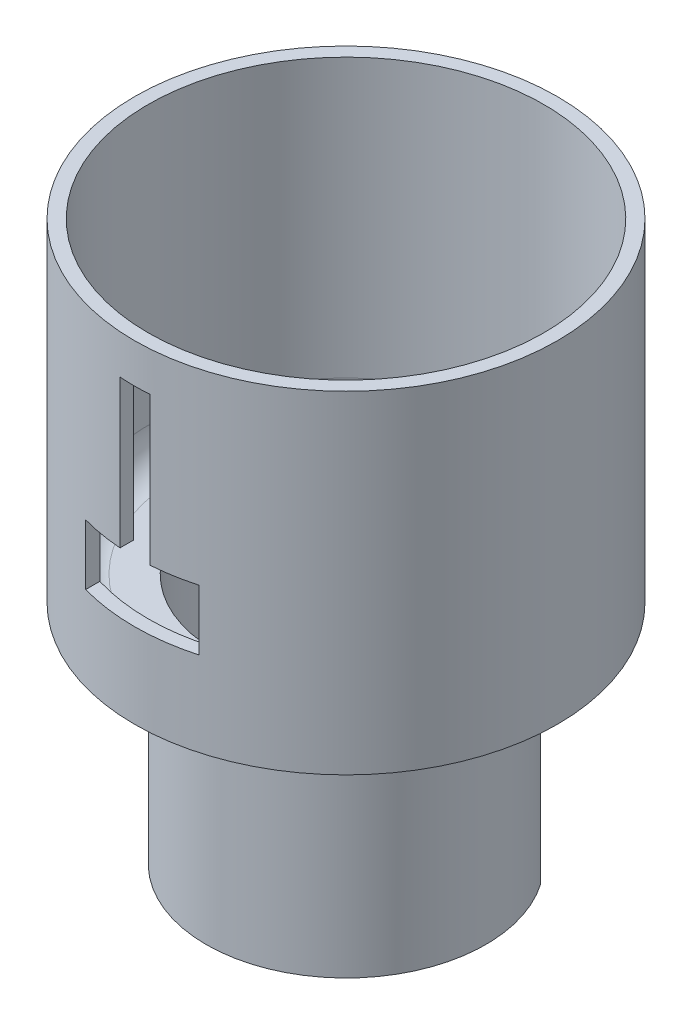
ISO-10303-21;
HEADER;
FILE_DESCRIPTION(('STEP AP214'),'2;1');
FILE_NAME('part.step','',(''),(''),'','','');
FILE_SCHEMA(('AUTOMOTIVE_DESIGN { 1 0 10303 214 1 1 1 1 }'));
ENDSEC;
DATA;
#1=APPLICATION_CONTEXT('core data for automotive mechanical design processes');
#2=APPLICATION_PROTOCOL_DEFINITION('international standard','automotive_design',2000,#1);
#3=PRODUCT_CONTEXT('',#1,'mechanical');
#4=PRODUCT('Part','Part','',(#3));
#5=PRODUCT_RELATED_PRODUCT_CATEGORY('part','',(#4));
#6=PRODUCT_DEFINITION_FORMATION('','',#4);
#7=PRODUCT_DEFINITION_CONTEXT('part definition',#1,'design');
#8=PRODUCT_DEFINITION('design','',#6,#7);
#9=PRODUCT_DEFINITION_SHAPE('','',#8);
#10=(LENGTH_UNIT() NAMED_UNIT(*) SI_UNIT(.MILLI.,.METRE.));
#11=(NAMED_UNIT(*) PLANE_ANGLE_UNIT() SI_UNIT($,.RADIAN.));
#12=(NAMED_UNIT(*) SI_UNIT($,.STERADIAN.) SOLID_ANGLE_UNIT());
#13=UNCERTAINTY_MEASURE_WITH_UNIT(LENGTH_MEASURE(1.E-05),#10,'distance_accuracy_value','');
#14=(GEOMETRIC_REPRESENTATION_CONTEXT(3) GLOBAL_UNCERTAINTY_ASSIGNED_CONTEXT((#13)) GLOBAL_UNIT_ASSIGNED_CONTEXT((#10,
#11,#12)) REPRESENTATION_CONTEXT('',''));
#15=CARTESIAN_POINT('',(0.,0.,0.));
#16=DIRECTION('',(0.,0.,1.));
#17=DIRECTION('',(1.,0.,0.));
#18=AXIS2_PLACEMENT_3D('',#15,#16,#17);
#19=CARTESIAN_POINT('',(0.,27.94,0.));
#20=DIRECTION('',(0.,-1.,0.));
#21=DIRECTION('',(0.,0.,-1.));
#22=AXIS2_PLACEMENT_3D('',#19,#20,#21);
#23=CYLINDRICAL_SURFACE('',#22,17.78);
#24=CARTESIAN_POINT('',(0.,27.94,0.));
#25=DIRECTION('',(0.,1.,0.));
#26=DIRECTION('',(0.,0.,1.));
#27=AXIS2_PLACEMENT_3D('',#24,#25,#26);
#28=CIRCLE('',#27,17.78);
#29=CARTESIAN_POINT('',(0.,27.94,17.78));
#30=VERTEX_POINT('',#29);
#31=EDGE_CURVE('E294',#30,#30,#28,.T.);
#32=ORIENTED_EDGE('',*,*,#31,.F.);
#33=EDGE_LOOP('',(#32));
#34=FACE_BOUND('',#33,.T.);
#35=CARTESIAN_POINT('',(0.,0.,0.));
#36=DIRECTION('',(0.,1.,0.));
#37=DIRECTION('',(0.,0.,1.));
#38=AXIS2_PLACEMENT_3D('',#35,#36,#37);
#39=CIRCLE('',#38,17.78);
#40=CARTESIAN_POINT('',(0.,0.,17.78));
#41=VERTEX_POINT('',#40);
#42=EDGE_CURVE('E292',#41,#41,#39,.T.);
#43=ORIENTED_EDGE('',*,*,#42,.T.);
#44=EDGE_LOOP('',(#43));
#45=FACE_BOUND('',#44,.T.);
#46=CARTESIAN_POINT('',(0.,7.112,0.));
#47=DIRECTION('',(0.,1.,0.));
#48=DIRECTION('',(-1.,0.,0.));
#49=AXIS2_PLACEMENT_3D('',#46,#47,#48);
#50=CIRCLE('',#49,17.78);
#51=CARTESIAN_POINT('',(-4.7625,7.112,17.1302946194746));
#52=VERTEX_POINT('',#51);
#53=CARTESIAN_POINT('',(4.7625,7.11200000000001,17.1302946194746));
#54=VERTEX_POINT('',#53);
#55=EDGE_CURVE('E353',#52,#54,#50,.T.);
#56=ORIENTED_EDGE('',*,*,#55,.F.);
#57=DIRECTION('',(0.,-1.,0.));
#58=VECTOR('',#57,1.);
#59=CARTESIAN_POINT('',(-4.76250000000001,27.94,17.1302946194746));
#60=LINE('',#59,#58);
#61=CARTESIAN_POINT('',(-4.7625,12.192,17.1302946194746));
#62=VERTEX_POINT('',#61);
#63=EDGE_CURVE('E356',#62,#52,#60,.T.);
#64=ORIENTED_EDGE('',*,*,#63,.F.);
#65=CARTESIAN_POINT('',(0.,12.192,0.));
#66=DIRECTION('',(0.,-1.,0.));
#67=DIRECTION('',(0.,0.,-1.));
#68=AXIS2_PLACEMENT_3D('',#65,#66,#67);
#69=CIRCLE('',#68,17.78);
#70=CARTESIAN_POINT('',(-1.27,12.192,17.7345848555866));
#71=VERTEX_POINT('',#70);
#72=EDGE_CURVE('E199',#71,#62,#69,.T.);
#73=ORIENTED_EDGE('',*,*,#72,.F.);
#74=DIRECTION('',(0.,-1.,0.));
#75=VECTOR('',#74,1.);
#76=CARTESIAN_POINT('',(-1.27000000000001,27.94,17.7345848555866));
#77=LINE('',#76,#75);
#78=CARTESIAN_POINT('',(-1.27000000000001,24.638,17.7345848555866));
#79=VERTEX_POINT('',#78);
#80=EDGE_CURVE('E193',#79,#71,#77,.T.);
#81=ORIENTED_EDGE('',*,*,#80,.F.);
#82=CARTESIAN_POINT('',(0.,24.638,0.));
#83=DIRECTION('',(0.,-1.,0.));
#84=DIRECTION('',(0.,0.,-1.));
#85=AXIS2_PLACEMENT_3D('',#82,#83,#84);
#86=CIRCLE('',#85,17.78);
#87=CARTESIAN_POINT('',(1.26999999999999,24.638,17.7345848555866));
#88=VERTEX_POINT('',#87);
#89=EDGE_CURVE('E183',#88,#79,#86,.T.);
#90=ORIENTED_EDGE('',*,*,#89,.F.);
#91=DIRECTION('',(0.,-1.,0.));
#92=VECTOR('',#91,1.);
#93=CARTESIAN_POINT('',(1.26999999999999,27.94,17.7345848555866));
#94=LINE('',#93,#92);
#95=CARTESIAN_POINT('',(1.27,12.192,17.7345848555866));
#96=VERTEX_POINT('',#95);
#97=EDGE_CURVE('E173',#96,#88,#94,.F.);
#98=ORIENTED_EDGE('',*,*,#97,.F.);
#99=CARTESIAN_POINT('',(0.,12.192,0.));
#100=DIRECTION('',(0.,-1.,0.));
#101=DIRECTION('',(1.,0.,0.));
#102=AXIS2_PLACEMENT_3D('',#99,#100,#101);
#103=CIRCLE('',#102,17.78);
#104=CARTESIAN_POINT('',(4.7625,12.192,17.1302946194746));
#105=VERTEX_POINT('',#104);
#106=EDGE_CURVE('E179',#105,#96,#103,.T.);
#107=ORIENTED_EDGE('',*,*,#106,.F.);
#108=DIRECTION('',(0.,-1.,0.));
#109=VECTOR('',#108,1.);
#110=CARTESIAN_POINT('',(4.7625,27.94,17.1302946194746));
#111=LINE('',#110,#109);
#112=EDGE_CURVE('E355',#54,#105,#111,.F.);
#113=ORIENTED_EDGE('',*,*,#112,.F.);
#114=EDGE_LOOP('',(#56,#64,#73,#81,#90,#98,#107,#113));
#115=FACE_BOUND('',#114,.T.);
#116=ADVANCED_FACE('F42',(#34,#45,#115),#23,.T.);
#117=CARTESIAN_POINT('',(0.,2.032,0.));
#118=DIRECTION('',(0.,1.,0.));
#119=DIRECTION('',(0.,0.,1.));
#120=AXIS2_PLACEMENT_3D('',#117,#118,#119);
#121=CYLINDRICAL_SURFACE('',#120,16.637);
#122=CARTESIAN_POINT('',(0.,27.94,0.));
#123=DIRECTION('',(0.,1.,0.));
#124=DIRECTION('',(0.,0.,1.));
#125=AXIS2_PLACEMENT_3D('',#122,#123,#124);
#126=CIRCLE('',#125,16.637);
#127=CARTESIAN_POINT('',(0.,27.94,16.637));
#128=VERTEX_POINT('',#127);
#129=EDGE_CURVE('E285',#128,#128,#126,.T.);
#130=ORIENTED_EDGE('',*,*,#129,.T.);
#131=EDGE_LOOP('',(#130));
#132=FACE_BOUND('',#131,.T.);
#133=CARTESIAN_POINT('',(0.,4.572,0.));
#134=DIRECTION('',(0.,1.,0.));
#135=DIRECTION('',(0.,0.,1.));
#136=AXIS2_PLACEMENT_3D('',#133,#134,#135);
#137=CIRCLE('',#136,16.637);
#138=CARTESIAN_POINT('',(0.,4.572,16.637));
#139=VERTEX_POINT('',#138);
#140=EDGE_CURVE('E308',#139,#139,#137,.F.);
#141=ORIENTED_EDGE('',*,*,#140,.T.);
#142=EDGE_LOOP('',(#141));
#143=FACE_BOUND('',#142,.T.);
#144=CARTESIAN_POINT('',(0.,24.638,0.));
#145=DIRECTION('',(0.,-1.,0.));
#146=DIRECTION('',(0.,0.,-1.));
#147=AXIS2_PLACEMENT_3D('',#144,#145,#146);
#148=CIRCLE('',#147,16.637);
#149=CARTESIAN_POINT('',(-1.27000000000001,24.638,16.588455895592));
#150=VERTEX_POINT('',#149);
#151=CARTESIAN_POINT('',(1.27000000000001,24.638,16.588455895592));
#152=VERTEX_POINT('',#151);
#153=EDGE_CURVE('E11',#150,#152,#148,.F.);
#154=ORIENTED_EDGE('',*,*,#153,.F.);
#155=DIRECTION('',(0.,1.,0.));
#156=VECTOR('',#155,1.);
#157=CARTESIAN_POINT('',(-1.27,2.032,16.588455895592));
#158=LINE('',#157,#156);
#159=CARTESIAN_POINT('',(-1.27,12.192,16.588455895592));
#160=VERTEX_POINT('',#159);
#161=EDGE_CURVE('E55',#160,#150,#158,.T.);
#162=ORIENTED_EDGE('',*,*,#161,.F.);
#163=CARTESIAN_POINT('',(0.,12.192,0.));
#164=DIRECTION('',(0.,-1.,0.));
#165=DIRECTION('',(0.,0.,-1.));
#166=AXIS2_PLACEMENT_3D('',#163,#164,#165);
#167=CIRCLE('',#166,16.637);
#168=CARTESIAN_POINT('',(-4.7625,12.192,15.9407767298209));
#169=VERTEX_POINT('',#168);
#170=EDGE_CURVE('E317',#169,#160,#167,.F.);
#171=ORIENTED_EDGE('',*,*,#170,.F.);
#172=DIRECTION('',(0.,1.,0.));
#173=VECTOR('',#172,1.);
#174=CARTESIAN_POINT('',(-4.7625,2.032,15.9407767298209));
#175=LINE('',#174,#173);
#176=CARTESIAN_POINT('',(-4.7625,7.112,15.9407767298209));
#177=VERTEX_POINT('',#176);
#178=EDGE_CURVE('E320',#177,#169,#175,.T.);
#179=ORIENTED_EDGE('',*,*,#178,.F.);
#180=CARTESIAN_POINT('',(0.,7.112,0.));
#181=DIRECTION('',(0.,1.,0.));
#182=DIRECTION('',(-1.,0.,0.));
#183=AXIS2_PLACEMENT_3D('',#180,#181,#182);
#184=CIRCLE('',#183,16.637);
#185=CARTESIAN_POINT('',(4.7625,7.11200000000001,15.9407767298209));
#186=VERTEX_POINT('',#185);
#187=EDGE_CURVE('E312',#186,#177,#184,.F.);
#188=ORIENTED_EDGE('',*,*,#187,.F.);
#189=DIRECTION('',(0.,1.,0.));
#190=VECTOR('',#189,1.);
#191=CARTESIAN_POINT('',(4.7625,2.032,15.9407767298209));
#192=LINE('',#191,#190);
#193=CARTESIAN_POINT('',(4.7625,12.192,15.9407767298209));
#194=VERTEX_POINT('',#193);
#195=EDGE_CURVE('E311',#194,#186,#192,.F.);
#196=ORIENTED_EDGE('',*,*,#195,.F.);
#197=CARTESIAN_POINT('',(0.,12.192,0.));
#198=DIRECTION('',(0.,-1.,0.));
#199=DIRECTION('',(1.,0.,0.));
#200=AXIS2_PLACEMENT_3D('',#197,#198,#199);
#201=CIRCLE('',#200,16.637);
#202=CARTESIAN_POINT('',(1.27,12.192,16.588455895592));
#203=VERTEX_POINT('',#202);
#204=EDGE_CURVE('E313',#203,#194,#201,.F.);
#205=ORIENTED_EDGE('',*,*,#204,.F.);
#206=DIRECTION('',(0.,1.,0.));
#207=VECTOR('',#206,1.);
#208=CARTESIAN_POINT('',(1.27000000000001,2.032,16.588455895592));
#209=LINE('',#208,#207);
#210=EDGE_CURVE('E310',#152,#203,#209,.F.);
#211=ORIENTED_EDGE('',*,*,#210,.F.);
#212=EDGE_LOOP('',(#154,#162,#171,#179,#188,#196,#205,#211));
#213=FACE_BOUND('',#212,.T.);
#214=ADVANCED_FACE('F328',(#132,#143,#213),#121,.F.);
#215=CARTESIAN_POINT('',(0.,-4.826,0.));
#216=DIRECTION('',(0.,1.,0.));
#217=DIRECTION('',(0.,0.,1.));
#218=AXIS2_PLACEMENT_3D('',#215,#216,#217);
#219=PLANE('',#218);
#220=CARTESIAN_POINT('',(0.,-4.826,0.));
#221=DIRECTION('',(0.,1.,0.));
#222=DIRECTION('',(0.,0.,1.));
#223=AXIS2_PLACEMENT_3D('',#220,#221,#222);
#224=CIRCLE('',#223,11.049);
#225=CARTESIAN_POINT('',(9.61949341909438,-4.826,-5.4356));
#226=VERTEX_POINT('',#225);
#227=CARTESIAN_POINT('',(-9.61949341909438,-4.826,-5.4356));
#228=VERTEX_POINT('',#227);
#229=EDGE_CURVE('E276',#226,#228,#224,.T.);
#230=ORIENTED_EDGE('',*,*,#229,.T.);
#231=DIRECTION('',(1.,0.,0.));
#232=VECTOR('',#231,1.);
#233=CARTESIAN_POINT('',(0.,-4.826,-5.4356));
#234=LINE('',#233,#232);
#235=EDGE_CURVE('E195',#228,#226,#234,.T.);
#236=ORIENTED_EDGE('',*,*,#235,.T.);
#237=EDGE_LOOP('',(#230,#236));
#238=FACE_BOUND('',#237,.T.);
#239=ADVANCED_FACE('F387',(#238),#219,.T.);
#240=CARTESIAN_POINT('',(-17.78,-19.05,-6.7056));
#241=DIRECTION('',(0.,0.,1.));
#242=DIRECTION('',(1.,0.,0.));
#243=AXIS2_PLACEMENT_3D('',#240,#241,#242);
#244=PLANE('',#243);
#245=DIRECTION('',(0.,-1.,0.));
#246=VECTOR('',#245,1.);
#247=CARTESIAN_POINT('',(0.9525,-19.05,-6.7056));
#248=LINE('',#247,#246);
#249=CARTESIAN_POINT('',(0.9525,-16.3922004312487,-6.7056));
#250=VERTEX_POINT('',#249);
#251=CARTESIAN_POINT('',(0.9525,-19.05,-6.7056));
#252=VERTEX_POINT('',#251);
#253=EDGE_CURVE('E225',#250,#252,#248,.T.);
#254=ORIENTED_EDGE('',*,*,#253,.F.);
#255=DIRECTION('',(1.,0.,0.));
#256=VECTOR('',#255,1.);
#257=CARTESIAN_POINT('',(-0.9525,-16.3922004312487,-6.7056));
#258=LINE('',#257,#256);
#259=CARTESIAN_POINT('',(-0.952499999999998,-16.3922004312487,-6.7056));
#260=VERTEX_POINT('',#259);
#261=EDGE_CURVE('E259',#260,#250,#258,.T.);
#262=ORIENTED_EDGE('',*,*,#261,.F.);
#263=DIRECTION('',(0.,-1.,0.));
#264=VECTOR('',#263,1.);
#265=CARTESIAN_POINT('',(-0.9525,-19.05,-6.7056));
#266=LINE('',#265,#264);
#267=CARTESIAN_POINT('',(-0.9525,-19.05,-6.7056));
#268=VERTEX_POINT('',#267);
#269=EDGE_CURVE('E239',#260,#268,#266,.T.);
#270=ORIENTED_EDGE('',*,*,#269,.T.);
#271=DIRECTION('',(1.,0.,0.));
#272=VECTOR('',#271,1.);
#273=CARTESIAN_POINT('',(-17.78,-19.05,-6.7056));
#274=LINE('',#273,#272);
#275=CARTESIAN_POINT('',(-9.66111963904805,-19.05,-6.7056));
#276=VERTEX_POINT('',#275);
#277=EDGE_CURVE('E264',#276,#268,#274,.T.);
#278=ORIENTED_EDGE('',*,*,#277,.F.);
#279=DIRECTION('',(0.,1.,0.));
#280=VECTOR('',#279,1.);
#281=CARTESIAN_POINT('',(-9.66111963904805,-19.05,-6.7056));
#282=LINE('',#281,#280);
#283=CARTESIAN_POINT('',(-9.66111963904805,-6.35,-6.7056));
#284=VERTEX_POINT('',#283);
#285=EDGE_CURVE('E275',#276,#284,#282,.T.);
#286=ORIENTED_EDGE('',*,*,#285,.T.);
#287=DIRECTION('',(1.,0.,0.));
#288=VECTOR('',#287,1.);
#289=CARTESIAN_POINT('',(-17.78,-6.35,-6.7056));
#290=LINE('',#289,#288);
#291=CARTESIAN_POINT('',(9.66111963904805,-6.35,-6.7056));
#292=VERTEX_POINT('',#291);
#293=EDGE_CURVE('E252',#284,#292,#290,.T.);
#294=ORIENTED_EDGE('',*,*,#293,.T.);
#295=DIRECTION('',(0.,1.,0.));
#296=VECTOR('',#295,1.);
#297=CARTESIAN_POINT('',(9.66111963904805,-19.05,-6.7056));
#298=LINE('',#297,#296);
#299=CARTESIAN_POINT('',(9.66111963904805,-19.05,-6.7056));
#300=VERTEX_POINT('',#299);
#301=EDGE_CURVE('E274',#292,#300,#298,.F.);
#302=ORIENTED_EDGE('',*,*,#301,.T.);
#303=EDGE_CURVE('E267',#252,#300,#274,.T.);
#304=ORIENTED_EDGE('',*,*,#303,.F.);
#305=EDGE_LOOP('',(#254,#262,#270,#278,#286,#294,#302,#304));
#306=FACE_BOUND('',#305,.T.);
#307=ADVANCED_FACE('F419',(#306),#244,.F.);
#308=CARTESIAN_POINT('',(-17.78,-6.35,-11.7602));
#309=DIRECTION('',(0.,1.,0.));
#310=DIRECTION('',(0.,0.,1.));
#311=AXIS2_PLACEMENT_3D('',#308,#309,#310);
#312=PLANE('',#311);
#313=DIRECTION('',(0.,0.,1.));
#314=VECTOR('',#313,1.);
#315=CARTESIAN_POINT('',(0.9525,-6.35,-9.7282));
#316=LINE('',#315,#314);
#317=CARTESIAN_POINT('',(0.9525,-6.35,-11.7215633679983));
#318=VERTEX_POINT('',#317);
#319=CARTESIAN_POINT('',(0.952499999999998,-6.35,-9.7282));
#320=VERTEX_POINT('',#319);
#321=EDGE_CURVE('E216',#318,#320,#316,.T.);
#322=ORIENTED_EDGE('',*,*,#321,.F.);
#323=CARTESIAN_POINT('',(0.,-6.35,0.));
#324=DIRECTION('',(0.,1.,0.));
#325=DIRECTION('',(0.,0.,1.));
#326=AXIS2_PLACEMENT_3D('',#323,#324,#325);
#327=CIRCLE('',#326,11.7602);
#328=EDGE_CURVE('E268',#318,#292,#327,.F.);
#329=ORIENTED_EDGE('',*,*,#328,.T.);
#330=ORIENTED_EDGE('',*,*,#293,.F.);
#331=CARTESIAN_POINT('',(-0.9525,-6.35,-11.7215633679983));
#332=VERTEX_POINT('',#331);
#333=EDGE_CURVE('E298',#284,#332,#327,.F.);
#334=ORIENTED_EDGE('',*,*,#333,.T.);
#335=DIRECTION('',(0.,0.,1.));
#336=VECTOR('',#335,1.);
#337=CARTESIAN_POINT('',(-0.9525,-6.35,-9.7282));
#338=LINE('',#337,#336);
#339=CARTESIAN_POINT('',(-0.9525,-6.35,-9.7282));
#340=VERTEX_POINT('',#339);
#341=EDGE_CURVE('E234',#332,#340,#338,.T.);
#342=ORIENTED_EDGE('',*,*,#341,.T.);
#343=DIRECTION('',(1.,0.,0.));
#344=VECTOR('',#343,1.);
#345=CARTESIAN_POINT('',(-0.9525,-6.35,-9.7282));
#346=LINE('',#345,#344);
#347=EDGE_CURVE('E249',#340,#320,#346,.T.);
#348=ORIENTED_EDGE('',*,*,#347,.T.);
#349=EDGE_LOOP('',(#322,#329,#330,#334,#342,#348));
#350=FACE_BOUND('',#349,.T.);
#351=ADVANCED_FACE('F397',(#350),#312,.F.);
#352=CARTESIAN_POINT('',(0.,27.94,0.));
#353=DIRECTION('',(0.,1.,0.));
#354=DIRECTION('',(0.,0.,1.));
#355=AXIS2_PLACEMENT_3D('',#352,#353,#354);
#356=PLANE('',#355);
#357=ORIENTED_EDGE('',*,*,#129,.F.);
#358=EDGE_LOOP('',(#357));
#359=FACE_BOUND('',#358,.T.);
#360=ORIENTED_EDGE('',*,*,#31,.T.);
#361=EDGE_LOOP('',(#360));
#362=FACE_BOUND('',#361,.T.);
#363=ADVANCED_FACE('F398',(#359,#362),#356,.T.);
#364=CARTESIAN_POINT('',(0.,0.,0.));
#365=DIRECTION('',(0.,1.,0.));
#366=DIRECTION('',(0.,0.,1.));
#367=AXIS2_PLACEMENT_3D('',#364,#365,#366);
#368=PLANE('',#367);
#369=CARTESIAN_POINT('',(0.,0.,0.));
#370=DIRECTION('',(0.,1.,0.));
#371=DIRECTION('',(0.,0.,1.));
#372=AXIS2_PLACEMENT_3D('',#369,#370,#371);
#373=CIRCLE('',#372,11.7602);
#374=CARTESIAN_POINT('',(0.,0.,11.7602));
#375=VERTEX_POINT('',#374);
#376=EDGE_CURVE('E290',#375,#375,#373,.T.);
#377=ORIENTED_EDGE('',*,*,#376,.T.);
#378=EDGE_LOOP('',(#377));
#379=FACE_BOUND('',#378,.T.);
#380=ORIENTED_EDGE('',*,*,#42,.F.);
#381=EDGE_LOOP('',(#380));
#382=FACE_BOUND('',#381,.T.);
#383=ADVANCED_FACE('F395',(#379,#382),#368,.F.);
#384=CARTESIAN_POINT('',(0.,-19.05,0.));
#385=DIRECTION('',(0.,1.,0.));
#386=DIRECTION('',(0.,0.,1.));
#387=AXIS2_PLACEMENT_3D('',#384,#385,#386);
#388=CYLINDRICAL_SURFACE('',#387,11.7602);
#389=ORIENTED_EDGE('',*,*,#301,.F.);
#390=ORIENTED_EDGE('',*,*,#328,.F.);
#391=CARTESIAN_POINT('',(0.,-6.35,-11.7602));
#392=VERTEX_POINT('',#391);
#393=EDGE_CURVE('E690',#392,#318,#327,.F.);
#394=ORIENTED_EDGE('',*,*,#393,.F.);
#395=EDGE_CURVE('E302',#332,#392,#327,.F.);
#396=ORIENTED_EDGE('',*,*,#395,.F.);
#397=ORIENTED_EDGE('',*,*,#333,.F.);
#398=ORIENTED_EDGE('',*,*,#285,.F.);
#399=CARTESIAN_POINT('',(0.,-19.05,0.));
#400=DIRECTION('',(0.,1.,0.));
#401=DIRECTION('',(0.,0.,1.));
#402=AXIS2_PLACEMENT_3D('',#399,#400,#401);
#403=CIRCLE('',#402,11.7602);
#404=EDGE_CURVE('E286',#276,#300,#403,.T.);
#405=ORIENTED_EDGE('',*,*,#404,.T.);
#406=EDGE_LOOP('',(#389,#390,#394,#396,#397,#398,#405));
#407=FACE_BOUND('',#406,.T.);
#408=ORIENTED_EDGE('',*,*,#376,.F.);
#409=EDGE_LOOP('',(#408));
#410=FACE_BOUND('',#409,.T.);
#411=ADVANCED_FACE('F394',(#407,#410),#388,.T.);
#412=CARTESIAN_POINT('',(0.,-19.05,0.));
#413=DIRECTION('',(0.,1.,0.));
#414=DIRECTION('',(0.,0.,1.));
#415=AXIS2_PLACEMENT_3D('',#412,#413,#414);
#416=PLANE('',#415);
#417=CARTESIAN_POINT('',(0.,-19.05,0.));
#418=DIRECTION('',(0.,-1.,0.));
#419=DIRECTION('',(0.,0.,-1.));
#420=AXIS2_PLACEMENT_3D('',#417,#418,#419);
#421=CIRCLE('',#420,2.54);
#422=CARTESIAN_POINT('',(0.,-19.05,-2.54));
#423=VERTEX_POINT('',#422);
#424=EDGE_CURVE('E188',#423,#423,#421,.T.);
#425=ORIENTED_EDGE('',*,*,#424,.F.);
#426=EDGE_LOOP('',(#425));
#427=FACE_BOUND('',#426,.T.);
#428=ORIENTED_EDGE('',*,*,#404,.F.);
#429=ORIENTED_EDGE('',*,*,#277,.T.);
#430=DIRECTION('',(1.,0.,0.));
#431=VECTOR('',#430,1.);
#432=CARTESIAN_POINT('',(-0.9525,-19.05,-6.7056));
#433=LINE('',#432,#431);
#434=EDGE_CURVE('E258',#268,#252,#433,.T.);
#435=ORIENTED_EDGE('',*,*,#434,.T.);
#436=ORIENTED_EDGE('',*,*,#303,.T.);
#437=EDGE_LOOP('',(#428,#429,#435,#436));
#438=FACE_BOUND('',#437,.T.);
#439=ADVANCED_FACE('F404',(#427,#438),#416,.F.);
#440=CARTESIAN_POINT('',(0.,2.032,0.));
#441=DIRECTION('',(0.,1.,0.));
#442=DIRECTION('',(0.,0.,1.));
#443=AXIS2_PLACEMENT_3D('',#440,#441,#442);
#444=PLANE('',#443);
#445=CARTESIAN_POINT('',(0.,2.032,0.));
#446=DIRECTION('',(0.,1.,0.));
#447=DIRECTION('',(0.,0.,1.));
#448=AXIS2_PLACEMENT_3D('',#445,#446,#447);
#449=CIRCLE('',#448,14.097);
#450=CARTESIAN_POINT('',(0.,2.032,14.097));
#451=VERTEX_POINT('',#450);
#452=EDGE_CURVE('E304',#451,#451,#449,.T.);
#453=ORIENTED_EDGE('',*,*,#452,.T.);
#454=EDGE_LOOP('',(#453));
#455=FACE_BOUND('',#454,.T.);
#456=CARTESIAN_POINT('',(0.,2.032,0.));
#457=DIRECTION('',(0.,1.,0.));
#458=DIRECTION('',(0.,0.,1.));
#459=AXIS2_PLACEMENT_3D('',#456,#457,#458);
#460=CIRCLE('',#459,11.049);
#461=CARTESIAN_POINT('',(0.,2.032,11.049));
#462=VERTEX_POINT('',#461);
#463=EDGE_CURVE('E279',#462,#462,#460,.T.);
#464=ORIENTED_EDGE('',*,*,#463,.F.);
#465=EDGE_LOOP('',(#464));
#466=FACE_BOUND('',#465,.T.);
#467=ADVANCED_FACE('F410',(#455,#466),#444,.T.);
#468=CARTESIAN_POINT('',(0.,-4.826,0.));
#469=DIRECTION('',(0.,1.,0.));
#470=DIRECTION('',(0.,0.,1.));
#471=AXIS2_PLACEMENT_3D('',#468,#469,#470);
#472=CYLINDRICAL_SURFACE('',#471,11.049);
#473=ORIENTED_EDGE('',*,*,#229,.F.);
#474=DIRECTION('',(0.,1.,0.));
#475=VECTOR('',#474,1.);
#476=CARTESIAN_POINT('',(9.61949341909438,-17.018,-5.4356));
#477=LINE('',#476,#475);
#478=CARTESIAN_POINT('',(9.61949341909438,-17.018,-5.4356));
#479=VERTEX_POINT('',#478);
#480=EDGE_CURVE('E207',#479,#226,#477,.T.);
#481=ORIENTED_EDGE('',*,*,#480,.F.);
#482=CARTESIAN_POINT('',(0.,-17.018,0.));
#483=DIRECTION('',(0.,1.,0.));
#484=DIRECTION('',(0.,0.,1.));
#485=AXIS2_PLACEMENT_3D('',#482,#483,#484);
#486=CIRCLE('',#485,11.049);
#487=CARTESIAN_POINT('',(-9.61949341909438,-17.018,-5.4356));
#488=VERTEX_POINT('',#487);
#489=EDGE_CURVE('E202',#488,#479,#486,.T.);
#490=ORIENTED_EDGE('',*,*,#489,.F.);
#491=DIRECTION('',(0.,1.,0.));
#492=VECTOR('',#491,1.);
#493=CARTESIAN_POINT('',(-9.61949341909438,-17.018,-5.4356));
#494=LINE('',#493,#492);
#495=EDGE_CURVE('E210',#488,#228,#494,.T.);
#496=ORIENTED_EDGE('',*,*,#495,.T.);
#497=EDGE_LOOP('',(#473,#481,#490,#496));
#498=FACE_BOUND('',#497,.T.);
#499=ORIENTED_EDGE('',*,*,#463,.T.);
#500=EDGE_LOOP('',(#499));
#501=FACE_BOUND('',#500,.T.);
#502=ADVANCED_FACE('F412',(#498,#501),#472,.F.);
#503=CARTESIAN_POINT('',(-0.9525,-6.35,-9.7282));
#504=DIRECTION('',(0.,1.,0.));
#505=DIRECTION('',(0.,0.,1.));
#506=AXIS2_PLACEMENT_3D('',#503,#504,#505);
#507=PLANE('',#506);
#508=CARTESIAN_POINT('',(-0.9525,-6.35,-11.7602));
#509=VERTEX_POINT('',#508);
#510=EDGE_CURVE('E229',#509,#332,#338,.T.);
#511=ORIENTED_EDGE('',*,*,#510,.T.);
#512=ORIENTED_EDGE('',*,*,#395,.T.);
#513=DIRECTION('',(1.,0.,0.));
#514=VECTOR('',#513,1.);
#515=CARTESIAN_POINT('',(-0.9525,-6.35,-11.7602));
#516=LINE('',#515,#514);
#517=EDGE_CURVE('E248',#509,#392,#516,.T.);
#518=ORIENTED_EDGE('',*,*,#517,.F.);
#519=EDGE_LOOP('',(#511,#512,#518));
#520=FACE_BOUND('',#519,.T.);
#521=ADVANCED_FACE('F418',(#520),#507,.T.);
#522=CARTESIAN_POINT('',(0.9525,-6.35,-11.7602));
#523=VERTEX_POINT('',#522);
#524=EDGE_CURVE('E251',#392,#523,#516,.T.);
#525=ORIENTED_EDGE('',*,*,#524,.F.);
#526=ORIENTED_EDGE('',*,*,#393,.T.);
#527=EDGE_CURVE('E211',#523,#318,#316,.T.);
#528=ORIENTED_EDGE('',*,*,#527,.F.);
#529=EDGE_LOOP('',(#525,#526,#528));
#530=FACE_BOUND('',#529,.T.);
#531=ADVANCED_FACE('F428',(#530),#507,.T.);
#532=CARTESIAN_POINT('',(-0.9525,-6.35,-11.7602));
#533=DIRECTION('',(0.,0.,-1.));
#534=DIRECTION('',(0.,1.,0.));
#535=AXIS2_PLACEMENT_3D('',#532,#533,#534);
#536=PLANE('',#535);
#537=ORIENTED_EDGE('',*,*,#517,.T.);
#538=ORIENTED_EDGE('',*,*,#524,.T.);
#539=DIRECTION('',(0.,1.,0.));
#540=VECTOR('',#539,1.);
#541=CARTESIAN_POINT('',(0.9525,-6.35,-11.7602));
#542=LINE('',#541,#540);
#543=CARTESIAN_POINT('',(0.9525,-14.7885454551572,-11.7602));
#544=VERTEX_POINT('',#543);
#545=EDGE_CURVE('E230',#544,#523,#542,.T.);
#546=ORIENTED_EDGE('',*,*,#545,.F.);
#547=DIRECTION('',(1.,0.,0.));
#548=VECTOR('',#547,1.);
#549=CARTESIAN_POINT('',(-0.9525,-14.7885454551572,-11.7602));
#550=LINE('',#549,#548);
#551=CARTESIAN_POINT('',(-0.9525,-14.7885454551572,-11.7602));
#552=VERTEX_POINT('',#551);
#553=EDGE_CURVE('E255',#552,#544,#550,.T.);
#554=ORIENTED_EDGE('',*,*,#553,.F.);
#555=DIRECTION('',(0.,1.,0.));
#556=VECTOR('',#555,1.);
#557=CARTESIAN_POINT('',(-0.9525,-6.35,-11.7602));
#558=LINE('',#557,#556);
#559=EDGE_CURVE('E244',#552,#509,#558,.T.);
#560=ORIENTED_EDGE('',*,*,#559,.T.);
#561=EDGE_LOOP('',(#537,#538,#546,#554,#560));
#562=FACE_BOUND('',#561,.T.);
#563=ADVANCED_FACE('F431',(#562),#536,.T.);
#564=CARTESIAN_POINT('',(-0.9525,-14.7885454551572,-11.7602));
#565=DIRECTION('',(0.,-0.764542226543695,-0.644573645002346));
#566=DIRECTION('',(0.,0.644573645002346,-0.764542226543695));
#567=AXIS2_PLACEMENT_3D('',#564,#565,#566);
#568=PLANE('',#567);
#569=ORIENTED_EDGE('',*,*,#553,.T.);
#570=DIRECTION('',(0.,0.644573645002346,-0.764542226543695));
#571=VECTOR('',#570,1.);
#572=CARTESIAN_POINT('',(0.9525,-14.7885454551572,-11.7602));
#573=LINE('',#572,#571);
#574=EDGE_CURVE('E221',#252,#544,#573,.T.);
#575=ORIENTED_EDGE('',*,*,#574,.F.);
#576=ORIENTED_EDGE('',*,*,#434,.F.);
#577=DIRECTION('',(0.,0.644573645002346,-0.764542226543695));
#578=VECTOR('',#577,1.);
#579=CARTESIAN_POINT('',(-0.9525,-14.7885454551572,-11.7602));
#580=LINE('',#579,#578);
#581=EDGE_CURVE('E245',#268,#552,#580,.T.);
#582=ORIENTED_EDGE('',*,*,#581,.T.);
#583=EDGE_LOOP('',(#569,#575,#576,#582));
#584=FACE_BOUND('',#583,.T.);
#585=ADVANCED_FACE('F442',(#584),#568,.T.);
#586=CARTESIAN_POINT('',(-0.9525,-16.3922004312487,-6.7056));
#587=DIRECTION('',(0.,0.764542226543694,0.644573645002346));
#588=DIRECTION('',(0.,-0.644573645002346,0.764542226543694));
#589=AXIS2_PLACEMENT_3D('',#586,#587,#588);
#590=PLANE('',#589);
#591=ORIENTED_EDGE('',*,*,#261,.T.);
#592=DIRECTION('',(0.,-0.644573645002346,0.764542226543694));
#593=VECTOR('',#592,1.);
#594=CARTESIAN_POINT('',(0.9525,-16.3922004312487,-6.7056));
#595=LINE('',#594,#593);
#596=CARTESIAN_POINT('',(0.9525,-13.8438934421216,-9.7282));
#597=VERTEX_POINT('',#596);
#598=EDGE_CURVE('E218',#597,#250,#595,.T.);
#599=ORIENTED_EDGE('',*,*,#598,.F.);
#600=DIRECTION('',(1.,0.,0.));
#601=VECTOR('',#600,1.);
#602=CARTESIAN_POINT('',(-0.9525,-13.8438934421216,-9.7282));
#603=LINE('',#602,#601);
#604=CARTESIAN_POINT('',(-0.9525,-13.8438934421216,-9.7282));
#605=VERTEX_POINT('',#604);
#606=EDGE_CURVE('E261',#605,#597,#603,.T.);
#607=ORIENTED_EDGE('',*,*,#606,.F.);
#608=DIRECTION('',(0.,-0.644573645002346,0.764542226543694));
#609=VECTOR('',#608,1.);
#610=CARTESIAN_POINT('',(-0.9525,-16.3922004312487,-6.7056));
#611=LINE('',#610,#609);
#612=EDGE_CURVE('E240',#605,#260,#611,.T.);
#613=ORIENTED_EDGE('',*,*,#612,.T.);
#614=EDGE_LOOP('',(#591,#599,#607,#613));
#615=FACE_BOUND('',#614,.T.);
#616=ADVANCED_FACE('F440',(#615),#590,.T.);
#617=CARTESIAN_POINT('',(-0.9525,-13.8438934421216,-9.7282));
#618=DIRECTION('',(0.,0.,1.));
#619=DIRECTION('',(1.,0.,0.));
#620=AXIS2_PLACEMENT_3D('',#617,#618,#619);
#621=PLANE('',#620);
#622=ORIENTED_EDGE('',*,*,#606,.T.);
#623=DIRECTION('',(0.,-1.,0.));
#624=VECTOR('',#623,1.);
#625=CARTESIAN_POINT('',(0.9525,-13.8438934421216,-9.7282));
#626=LINE('',#625,#624);
#627=EDGE_CURVE('E214',#320,#597,#626,.T.);
#628=ORIENTED_EDGE('',*,*,#627,.F.);
#629=ORIENTED_EDGE('',*,*,#347,.F.);
#630=DIRECTION('',(0.,-1.,0.));
#631=VECTOR('',#630,1.);
#632=CARTESIAN_POINT('',(-0.9525,-13.8438934421216,-9.7282));
#633=LINE('',#632,#631);
#634=EDGE_CURVE('E231',#340,#605,#633,.T.);
#635=ORIENTED_EDGE('',*,*,#634,.T.);
#636=EDGE_LOOP('',(#622,#628,#629,#635));
#637=FACE_BOUND('',#636,.T.);
#638=ADVANCED_FACE('F433',(#637),#621,.T.);
#639=CARTESIAN_POINT('',(-0.9525,0.,0.));
#640=DIRECTION('',(-1.,0.,0.));
#641=DIRECTION('',(0.,0.,1.));
#642=AXIS2_PLACEMENT_3D('',#639,#640,#641);
#643=PLANE('',#642);
#644=ORIENTED_EDGE('',*,*,#510,.F.);
#645=ORIENTED_EDGE('',*,*,#559,.F.);
#646=ORIENTED_EDGE('',*,*,#581,.F.);
#647=ORIENTED_EDGE('',*,*,#269,.F.);
#648=ORIENTED_EDGE('',*,*,#612,.F.);
#649=ORIENTED_EDGE('',*,*,#634,.F.);
#650=ORIENTED_EDGE('',*,*,#341,.F.);
#651=EDGE_LOOP('',(#644,#645,#646,#647,#648,#649,#650));
#652=FACE_BOUND('',#651,.T.);
#653=ADVANCED_FACE('F436',(#652),#643,.T.);
#654=CARTESIAN_POINT('',(0.9525,0.,0.));
#655=DIRECTION('',(-1.,0.,0.));
#656=DIRECTION('',(0.,0.,1.));
#657=AXIS2_PLACEMENT_3D('',#654,#655,#656);
#658=PLANE('',#657);
#659=ORIENTED_EDGE('',*,*,#527,.T.);
#660=ORIENTED_EDGE('',*,*,#321,.T.);
#661=ORIENTED_EDGE('',*,*,#627,.T.);
#662=ORIENTED_EDGE('',*,*,#598,.T.);
#663=ORIENTED_EDGE('',*,*,#253,.T.);
#664=ORIENTED_EDGE('',*,*,#574,.T.);
#665=ORIENTED_EDGE('',*,*,#545,.T.);
#666=EDGE_LOOP('',(#659,#660,#661,#662,#663,#664,#665));
#667=FACE_BOUND('',#666,.T.);
#668=ADVANCED_FACE('F453',(#667),#658,.F.);
#669=CARTESIAN_POINT('',(0.,-17.018,-5.4356));
#670=DIRECTION('',(0.,0.,1.));
#671=DIRECTION('',(1.,0.,0.));
#672=AXIS2_PLACEMENT_3D('',#669,#670,#671);
#673=PLANE('',#672);
#674=ORIENTED_EDGE('',*,*,#235,.F.);
#675=ORIENTED_EDGE('',*,*,#495,.F.);
#676=DIRECTION('',(1.,0.,0.));
#677=VECTOR('',#676,1.);
#678=CARTESIAN_POINT('',(0.,-17.018,-5.4356));
#679=LINE('',#678,#677);
#680=EDGE_CURVE('E196',#488,#479,#679,.T.);
#681=ORIENTED_EDGE('',*,*,#680,.T.);
#682=ORIENTED_EDGE('',*,*,#480,.T.);
#683=EDGE_LOOP('',(#674,#675,#681,#682));
#684=FACE_BOUND('',#683,.T.);
#685=ADVANCED_FACE('F452',(#684),#673,.T.);
#686=CARTESIAN_POINT('',(0.,-17.018,0.));
#687=DIRECTION('',(0.,1.,0.));
#688=DIRECTION('',(0.,0.,1.));
#689=AXIS2_PLACEMENT_3D('',#686,#687,#688);
#690=PLANE('',#689);
#691=CARTESIAN_POINT('',(0.,-17.018,0.));
#692=DIRECTION('',(0.,1.,0.));
#693=DIRECTION('',(0.,0.,1.));
#694=AXIS2_PLACEMENT_3D('',#691,#692,#693);
#695=CIRCLE('',#694,2.54);
#696=CARTESIAN_POINT('',(0.,-17.018,2.54));
#697=VERTEX_POINT('',#696);
#698=EDGE_CURVE('E713',#697,#697,#695,.F.);
#699=ORIENTED_EDGE('',*,*,#698,.T.);
#700=EDGE_LOOP('',(#699));
#701=FACE_BOUND('',#700,.T.);
#702=ORIENTED_EDGE('',*,*,#680,.F.);
#703=ORIENTED_EDGE('',*,*,#489,.T.);
#704=EDGE_LOOP('',(#702,#703));
#705=FACE_BOUND('',#704,.T.);
#706=ADVANCED_FACE('F459',(#701,#705),#690,.T.);
#707=CARTESIAN_POINT('',(0.,4.572,0.));
#708=DIRECTION('',(0.,1.,0.));
#709=DIRECTION('',(0.,0.,1.));
#710=AXIS2_PLACEMENT_3D('',#707,#708,#709);
#711=TOROIDAL_SURFACE('',#710,14.097,2.54);
#712=ORIENTED_EDGE('',*,*,#140,.F.);
#713=EDGE_LOOP('',(#712));
#714=FACE_BOUND('',#713,.T.);
#715=ORIENTED_EDGE('',*,*,#452,.F.);
#716=EDGE_LOOP('',(#715));
#717=FACE_BOUND('',#716,.T.);
#718=ADVANCED_FACE('F46',(#714,#717),#711,.F.);
#719=CARTESIAN_POINT('',(1.26999999999999,24.638,17.78));
#720=DIRECTION('',(0.,-1.,0.));
#721=DIRECTION('',(0.,0.,-1.));
#722=AXIS2_PLACEMENT_3D('',#719,#720,#721);
#723=PLANE('',#722);
#724=ORIENTED_EDGE('',*,*,#89,.T.);
#725=DIRECTION('',(0.,0.,-1.));
#726=VECTOR('',#725,1.);
#727=CARTESIAN_POINT('',(-1.27000000000001,24.638,17.78));
#728=LINE('',#727,#726);
#729=EDGE_CURVE('E177',#79,#150,#728,.T.);
#730=ORIENTED_EDGE('',*,*,#729,.T.);
#731=ORIENTED_EDGE('',*,*,#153,.T.);
#732=DIRECTION('',(0.,0.,-1.));
#733=VECTOR('',#732,1.);
#734=CARTESIAN_POINT('',(1.26999999999999,24.638,17.78));
#735=LINE('',#734,#733);
#736=EDGE_CURVE('E63',#88,#152,#735,.T.);
#737=ORIENTED_EDGE('',*,*,#736,.F.);
#738=EDGE_LOOP('',(#724,#730,#731,#737));
#739=FACE_BOUND('',#738,.T.);
#740=ADVANCED_FACE('F181',(#739),#723,.T.);
#741=CARTESIAN_POINT('',(-1.27000000000001,24.638,17.78));
#742=DIRECTION('',(1.,0.,0.));
#743=DIRECTION('',(0.,1.,0.));
#744=AXIS2_PLACEMENT_3D('',#741,#742,#743);
#745=PLANE('',#744);
#746=ORIENTED_EDGE('',*,*,#80,.T.);
#747=DIRECTION('',(0.,0.,-1.));
#748=VECTOR('',#747,1.);
#749=CARTESIAN_POINT('',(-1.27,12.192,17.78));
#750=LINE('',#749,#748);
#751=EDGE_CURVE('E324',#71,#160,#750,.T.);
#752=ORIENTED_EDGE('',*,*,#751,.T.);
#753=ORIENTED_EDGE('',*,*,#161,.T.);
#754=ORIENTED_EDGE('',*,*,#729,.F.);
#755=EDGE_LOOP('',(#746,#752,#753,#754));
#756=FACE_BOUND('',#755,.T.);
#757=ADVANCED_FACE('F323',(#756),#745,.T.);
#758=CARTESIAN_POINT('',(-4.7625,12.192,17.78));
#759=DIRECTION('',(0.,-1.,0.));
#760=DIRECTION('',(0.,0.,-1.));
#761=AXIS2_PLACEMENT_3D('',#758,#759,#760);
#762=PLANE('',#761);
#763=ORIENTED_EDGE('',*,*,#72,.T.);
#764=DIRECTION('',(0.,0.,-1.));
#765=VECTOR('',#764,1.);
#766=CARTESIAN_POINT('',(-4.7625,12.192,17.78));
#767=LINE('',#766,#765);
#768=EDGE_CURVE('E350',#62,#169,#767,.T.);
#769=ORIENTED_EDGE('',*,*,#768,.T.);
#770=ORIENTED_EDGE('',*,*,#170,.T.);
#771=ORIENTED_EDGE('',*,*,#751,.F.);
#772=EDGE_LOOP('',(#763,#769,#770,#771));
#773=FACE_BOUND('',#772,.T.);
#774=ADVANCED_FACE('F358',(#773),#762,.T.);
#775=CARTESIAN_POINT('',(-4.7625,7.112,17.78));
#776=DIRECTION('',(1.,0.,0.));
#777=DIRECTION('',(0.,1.,0.));
#778=AXIS2_PLACEMENT_3D('',#775,#776,#777);
#779=PLANE('',#778);
#780=ORIENTED_EDGE('',*,*,#63,.T.);
#781=DIRECTION('',(0.,0.,-1.));
#782=VECTOR('',#781,1.);
#783=CARTESIAN_POINT('',(-4.7625,7.112,17.78));
#784=LINE('',#783,#782);
#785=EDGE_CURVE('E344',#52,#177,#784,.T.);
#786=ORIENTED_EDGE('',*,*,#785,.T.);
#787=ORIENTED_EDGE('',*,*,#178,.T.);
#788=ORIENTED_EDGE('',*,*,#768,.F.);
#789=EDGE_LOOP('',(#780,#786,#787,#788));
#790=FACE_BOUND('',#789,.T.);
#791=ADVANCED_FACE('F362',(#790),#779,.T.);
#792=CARTESIAN_POINT('',(4.7625,7.11200000000001,17.78));
#793=DIRECTION('',(0.,1.,0.));
#794=DIRECTION('',(-1.,0.,0.));
#795=AXIS2_PLACEMENT_3D('',#792,#793,#794);
#796=PLANE('',#795);
#797=ORIENTED_EDGE('',*,*,#55,.T.);
#798=DIRECTION('',(0.,0.,-1.));
#799=VECTOR('',#798,1.);
#800=CARTESIAN_POINT('',(4.7625,7.11200000000001,17.78));
#801=LINE('',#800,#799);
#802=EDGE_CURVE('E337',#54,#186,#801,.T.);
#803=ORIENTED_EDGE('',*,*,#802,.T.);
#804=ORIENTED_EDGE('',*,*,#187,.T.);
#805=ORIENTED_EDGE('',*,*,#785,.F.);
#806=EDGE_LOOP('',(#797,#803,#804,#805));
#807=FACE_BOUND('',#806,.T.);
#808=ADVANCED_FACE('F366',(#807),#796,.T.);
#809=CARTESIAN_POINT('',(4.7625,12.192,17.78));
#810=DIRECTION('',(-1.,0.,0.));
#811=DIRECTION('',(0.,-1.,0.));
#812=AXIS2_PLACEMENT_3D('',#809,#810,#811);
#813=PLANE('',#812);
#814=ORIENTED_EDGE('',*,*,#112,.T.);
#815=DIRECTION('',(0.,0.,-1.));
#816=VECTOR('',#815,1.);
#817=CARTESIAN_POINT('',(4.7625,12.192,17.78));
#818=LINE('',#817,#816);
#819=EDGE_CURVE('E336',#105,#194,#818,.T.);
#820=ORIENTED_EDGE('',*,*,#819,.T.);
#821=ORIENTED_EDGE('',*,*,#195,.T.);
#822=ORIENTED_EDGE('',*,*,#802,.F.);
#823=EDGE_LOOP('',(#814,#820,#821,#822));
#824=FACE_BOUND('',#823,.T.);
#825=ADVANCED_FACE('F371',(#824),#813,.T.);
#826=CARTESIAN_POINT('',(1.27,12.192,17.78));
#827=DIRECTION('',(0.,-1.,0.));
#828=DIRECTION('',(1.,0.,0.));
#829=AXIS2_PLACEMENT_3D('',#826,#827,#828);
#830=PLANE('',#829);
#831=ORIENTED_EDGE('',*,*,#106,.T.);
#832=DIRECTION('',(0.,0.,-1.));
#833=VECTOR('',#832,1.);
#834=CARTESIAN_POINT('',(1.27,12.192,17.78));
#835=LINE('',#834,#833);
#836=EDGE_CURVE('E56',#96,#203,#835,.T.);
#837=ORIENTED_EDGE('',*,*,#836,.T.);
#838=ORIENTED_EDGE('',*,*,#204,.T.);
#839=ORIENTED_EDGE('',*,*,#819,.F.);
#840=EDGE_LOOP('',(#831,#837,#838,#839));
#841=FACE_BOUND('',#840,.T.);
#842=ADVANCED_FACE('F334',(#841),#830,.T.);
#843=CARTESIAN_POINT('',(1.27,12.192,17.78));
#844=DIRECTION('',(-1.,0.,0.));
#845=DIRECTION('',(0.,-1.,0.));
#846=AXIS2_PLACEMENT_3D('',#843,#844,#845);
#847=PLANE('',#846);
#848=ORIENTED_EDGE('',*,*,#97,.T.);
#849=ORIENTED_EDGE('',*,*,#736,.T.);
#850=ORIENTED_EDGE('',*,*,#210,.T.);
#851=ORIENTED_EDGE('',*,*,#836,.F.);
#852=EDGE_LOOP('',(#848,#849,#850,#851));
#853=FACE_BOUND('',#852,.T.);
#854=ADVANCED_FACE('F174',(#853),#847,.T.);
#855=CARTESIAN_POINT('',(0.,27.941,0.));
#856=DIRECTION('',(0.,-1.,0.));
#857=DIRECTION('',(0.,0.,-1.));
#858=AXIS2_PLACEMENT_3D('',#855,#856,#857);
#859=CYLINDRICAL_SURFACE('',#858,2.54);
#860=ORIENTED_EDGE('',*,*,#698,.F.);
#861=EDGE_LOOP('',(#860));
#862=FACE_BOUND('',#861,.T.);
#863=ORIENTED_EDGE('',*,*,#424,.T.);
#864=EDGE_LOOP('',(#863));
#865=FACE_BOUND('',#864,.T.);
#866=ADVANCED_FACE('F502',(#862,#865),#859,.F.);
#867=CLOSED_SHELL('',(#116,#214,#239,#307,#351,#363,#383,#411,#439,#467,#502,#521,#531,#563,
#585,#616,#638,#653,#668,#685,#706,#718,#740,#757,#774,#791,#808,#825,#842,#854,#866));
#868=MANIFOLD_SOLID_BREP('B2',#867);
#869=ADVANCED_BREP_SHAPE_REPRESENTATION('',(#18,#868),#14);
#870=SHAPE_DEFINITION_REPRESENTATION(#9,#869);
ENDSEC;
END-ISO-10303-21;
